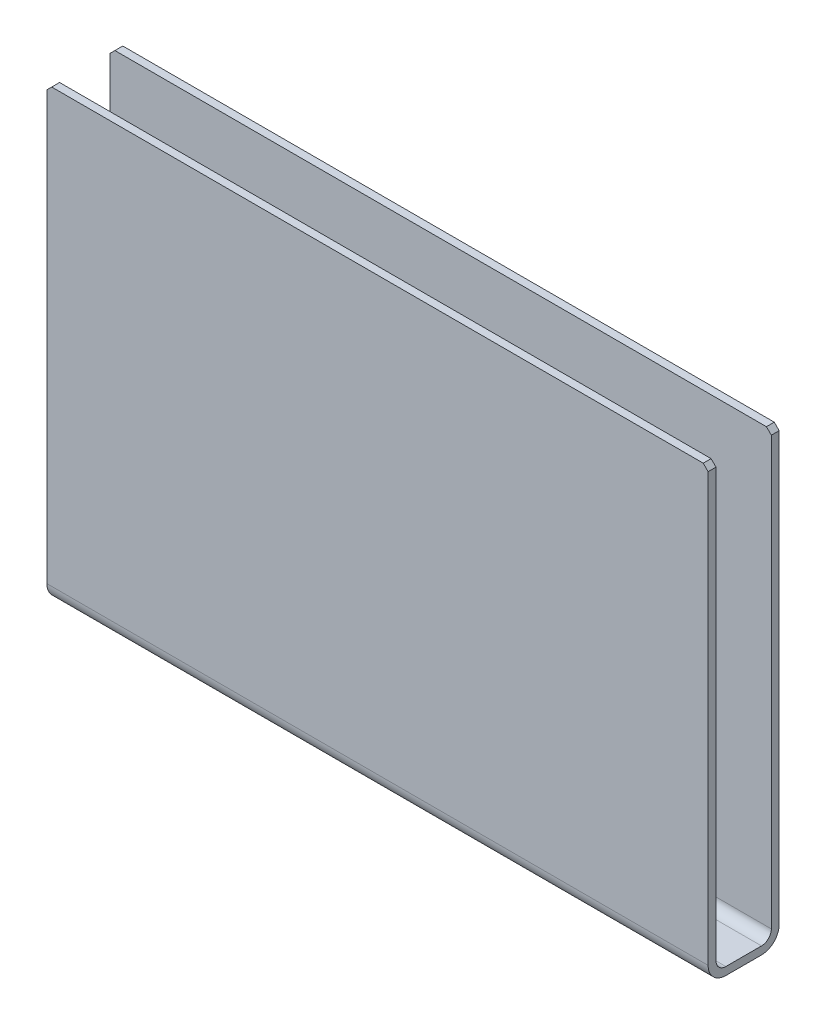
ISO-10303-21;
HEADER;
FILE_DESCRIPTION(('STEP AP214'),'2;1');
FILE_NAME('part.step','',(''),(''),'','','');
FILE_SCHEMA(('AUTOMOTIVE_DESIGN { 1 0 10303 214 1 1 1 1 }'));
ENDSEC;
DATA;
#1=APPLICATION_CONTEXT('core data for automotive mechanical design processes');
#2=APPLICATION_PROTOCOL_DEFINITION('international standard','automotive_design',2000,#1);
#3=PRODUCT_CONTEXT('',#1,'mechanical');
#4=PRODUCT('Part','Part','',(#3));
#5=PRODUCT_RELATED_PRODUCT_CATEGORY('part','',(#4));
#6=PRODUCT_DEFINITION_FORMATION('','',#4);
#7=PRODUCT_DEFINITION_CONTEXT('part definition',#1,'design');
#8=PRODUCT_DEFINITION('design','',#6,#7);
#9=PRODUCT_DEFINITION_SHAPE('','',#8);
#10=(LENGTH_UNIT() NAMED_UNIT(*) SI_UNIT(.MILLI.,.METRE.));
#11=(NAMED_UNIT(*) PLANE_ANGLE_UNIT() SI_UNIT($,.RADIAN.));
#12=(NAMED_UNIT(*) SI_UNIT($,.STERADIAN.) SOLID_ANGLE_UNIT());
#13=UNCERTAINTY_MEASURE_WITH_UNIT(LENGTH_MEASURE(1.E-05),#10,'distance_accuracy_value','');
#14=(GEOMETRIC_REPRESENTATION_CONTEXT(3) GLOBAL_UNCERTAINTY_ASSIGNED_CONTEXT((#13)) GLOBAL_UNIT_ASSIGNED_CONTEXT((#10,
#11,#12)) REPRESENTATION_CONTEXT('',''));
#15=CARTESIAN_POINT('',(0.,0.,0.));
#16=DIRECTION('',(0.,0.,1.));
#17=DIRECTION('',(1.,0.,0.));
#18=AXIS2_PLACEMENT_3D('',#15,#16,#17);
#19=CARTESIAN_POINT('',(2.5,5.4,2.4));
#20=DIRECTION('',(-1.,0.,0.));
#21=DIRECTION('',(0.,1.,0.));
#22=AXIS2_PLACEMENT_3D('',#19,#20,#21);
#23=PLANE('',#22);
#24=DIRECTION('',(0.,-1.,0.));
#25=VECTOR('',#24,1.);
#26=CARTESIAN_POINT('',(2.5,137.5,21.7));
#27=LINE('',#26,#25);
#28=CARTESIAN_POINT('',(2.5,136.,21.7));
#29=VERTEX_POINT('',#28);
#30=CARTESIAN_POINT('',(2.5,5.4,21.7));
#31=VERTEX_POINT('',#30);
#32=EDGE_CURVE('E154',#29,#31,#27,.T.);
#33=ORIENTED_EDGE('',*,*,#32,.F.);
#34=DIRECTION('',(0.,0.,-1.));
#35=VECTOR('',#34,1.);
#36=CARTESIAN_POINT('',(2.5,136.,2.4));
#37=LINE('',#36,#35);
#38=CARTESIAN_POINT('',(2.5,136.,19.3));
#39=VERTEX_POINT('',#38);
#40=EDGE_CURVE('E246',#29,#39,#37,.T.);
#41=ORIENTED_EDGE('',*,*,#40,.T.);
#42=DIRECTION('',(0.,-1.,0.));
#43=VECTOR('',#42,1.);
#44=CARTESIAN_POINT('',(2.5,137.5,19.3));
#45=LINE('',#44,#43);
#46=CARTESIAN_POINT('',(2.5,5.4,19.3));
#47=VERTEX_POINT('',#46);
#48=EDGE_CURVE('E177',#39,#47,#45,.T.);
#49=ORIENTED_EDGE('',*,*,#48,.T.);
#50=CARTESIAN_POINT('',(2.5,5.4,16.3));
#51=DIRECTION('',(1.,0.,0.));
#52=DIRECTION('',(0.,1.,0.));
#53=AXIS2_PLACEMENT_3D('',#50,#51,#52);
#54=CIRCLE('',#53,3.);
#55=CARTESIAN_POINT('',(2.5,2.4,16.3));
#56=VERTEX_POINT('',#55);
#57=EDGE_CURVE('E190',#47,#56,#54,.T.);
#58=ORIENTED_EDGE('',*,*,#57,.T.);
#59=DIRECTION('',(0.,0.,-1.));
#60=VECTOR('',#59,1.);
#61=CARTESIAN_POINT('',(2.5,2.4,16.3));
#62=LINE('',#61,#60);
#63=CARTESIAN_POINT('',(2.5,2.4,5.4));
#64=VERTEX_POINT('',#63);
#65=EDGE_CURVE('E195',#56,#64,#62,.T.);
#66=ORIENTED_EDGE('',*,*,#65,.T.);
#67=CARTESIAN_POINT('',(2.5,5.4,5.4));
#68=DIRECTION('',(1.,0.,0.));
#69=DIRECTION('',(0.,1.,0.));
#70=AXIS2_PLACEMENT_3D('',#67,#68,#69);
#71=CIRCLE('',#70,3.);
#72=CARTESIAN_POINT('',(2.5,5.4,2.4));
#73=VERTEX_POINT('',#72);
#74=EDGE_CURVE('E200',#64,#73,#71,.T.);
#75=ORIENTED_EDGE('',*,*,#74,.T.);
#76=DIRECTION('',(0.,1.,0.));
#77=VECTOR('',#76,1.);
#78=CARTESIAN_POINT('',(2.5,5.4,2.4));
#79=LINE('',#78,#77);
#80=CARTESIAN_POINT('',(2.5,136.,2.4));
#81=VERTEX_POINT('',#80);
#82=EDGE_CURVE('E205',#73,#81,#79,.T.);
#83=ORIENTED_EDGE('',*,*,#82,.T.);
#84=DIRECTION('',(0.,0.,-1.));
#85=VECTOR('',#84,1.);
#86=CARTESIAN_POINT('',(2.5,136.,2.4));
#87=LINE('',#86,#85);
#88=CARTESIAN_POINT('',(2.5,136.,0.));
#89=VERTEX_POINT('',#88);
#90=EDGE_CURVE('E243',#81,#89,#87,.T.);
#91=ORIENTED_EDGE('',*,*,#90,.T.);
#92=DIRECTION('',(0.,1.,0.));
#93=VECTOR('',#92,1.);
#94=CARTESIAN_POINT('',(2.5,5.4,0.));
#95=LINE('',#94,#93);
#96=CARTESIAN_POINT('',(2.5,5.4,0.));
#97=VERTEX_POINT('',#96);
#98=EDGE_CURVE('E168',#97,#89,#95,.T.);
#99=ORIENTED_EDGE('',*,*,#98,.F.);
#100=CARTESIAN_POINT('',(2.5,5.4,5.4));
#101=DIRECTION('',(1.,0.,0.));
#102=DIRECTION('',(0.,0.,-1.));
#103=AXIS2_PLACEMENT_3D('',#100,#101,#102);
#104=CIRCLE('',#103,5.4);
#105=CARTESIAN_POINT('',(2.5,0.,5.4));
#106=VERTEX_POINT('',#105);
#107=EDGE_CURVE('E164',#106,#97,#104,.T.);
#108=ORIENTED_EDGE('',*,*,#107,.F.);
#109=DIRECTION('',(0.,0.,-1.));
#110=VECTOR('',#109,1.);
#111=CARTESIAN_POINT('',(2.5,0.,16.3));
#112=LINE('',#111,#110);
#113=CARTESIAN_POINT('',(2.5,0.,16.3));
#114=VERTEX_POINT('',#113);
#115=EDGE_CURVE('E150',#114,#106,#112,.T.);
#116=ORIENTED_EDGE('',*,*,#115,.F.);
#117=CARTESIAN_POINT('',(2.5,5.4,16.3));
#118=DIRECTION('',(1.,0.,0.));
#119=DIRECTION('',(0.,0.,-1.));
#120=AXIS2_PLACEMENT_3D('',#117,#118,#119);
#121=CIRCLE('',#120,5.4);
#122=EDGE_CURVE('E142',#31,#114,#121,.T.);
#123=ORIENTED_EDGE('',*,*,#122,.F.);
#124=EDGE_LOOP('',(#33,#41,#49,#58,#66,#75,#83,#91,#99,#108,#116,#123));
#125=FACE_BOUND('',#124,.T.);
#126=ADVANCED_FACE('F16',(#125),#23,.T.);
#127=CARTESIAN_POINT('',(2.5,137.5,2.4));
#128=DIRECTION('',(0.,1.,0.));
#129=DIRECTION('',(1.,0.,0.));
#130=AXIS2_PLACEMENT_3D('',#127,#128,#129);
#131=PLANE('',#130);
#132=DIRECTION('',(-1.,0.,0.));
#133=VECTOR('',#132,1.);
#134=CARTESIAN_POINT('',(2.5,137.5,0.));
#135=LINE('',#134,#133);
#136=CARTESIAN_POINT('',(4.,137.5,0.));
#137=VERTEX_POINT('',#136);
#138=CARTESIAN_POINT('',(203.,137.5,0.));
#139=VERTEX_POINT('',#138);
#140=EDGE_CURVE('E174',#137,#139,#135,.F.);
#141=ORIENTED_EDGE('',*,*,#140,.F.);
#142=DIRECTION('',(0.,0.,1.));
#143=VECTOR('',#142,1.);
#144=CARTESIAN_POINT('',(4.,137.5,2.4));
#145=LINE('',#144,#143);
#146=CARTESIAN_POINT('',(4.,137.5,2.4));
#147=VERTEX_POINT('',#146);
#148=EDGE_CURVE('E37',#137,#147,#145,.T.);
#149=ORIENTED_EDGE('',*,*,#148,.T.);
#150=DIRECTION('',(1.,0.,0.));
#151=VECTOR('',#150,1.);
#152=CARTESIAN_POINT('',(2.5,137.5,2.4));
#153=LINE('',#152,#151);
#154=CARTESIAN_POINT('',(203.,137.5,2.4));
#155=VERTEX_POINT('',#154);
#156=EDGE_CURVE('E208',#147,#155,#153,.T.);
#157=ORIENTED_EDGE('',*,*,#156,.T.);
#158=DIRECTION('',(0.,0.,-1.));
#159=VECTOR('',#158,1.);
#160=CARTESIAN_POINT('',(203.,137.5,2.4));
#161=LINE('',#160,#159);
#162=EDGE_CURVE('E252',#155,#139,#161,.T.);
#163=ORIENTED_EDGE('',*,*,#162,.T.);
#164=EDGE_LOOP('',(#141,#149,#157,#163));
#165=FACE_BOUND('',#164,.T.);
#166=ADVANCED_FACE('F256',(#165),#131,.T.);
#167=CARTESIAN_POINT('',(204.5,137.5,19.3));
#168=DIRECTION('',(-1.,0.,0.));
#169=DIRECTION('',(0.,-1.,0.));
#170=AXIS2_PLACEMENT_3D('',#167,#168,#169);
#171=PLANE('',#170);
#172=DIRECTION('',(0.,-1.,0.));
#173=VECTOR('',#172,1.);
#174=CARTESIAN_POINT('',(204.5,137.5,19.3));
#175=LINE('',#174,#173);
#176=CARTESIAN_POINT('',(204.5,136.,19.3));
#177=VERTEX_POINT('',#176);
#178=CARTESIAN_POINT('',(204.5,5.4,19.3));
#179=VERTEX_POINT('',#178);
#180=EDGE_CURVE('E193',#177,#179,#175,.T.);
#181=ORIENTED_EDGE('',*,*,#180,.F.);
#182=DIRECTION('',(0.,0.,-1.));
#183=VECTOR('',#182,1.);
#184=CARTESIAN_POINT('',(204.5,136.,19.3));
#185=LINE('',#184,#183);
#186=CARTESIAN_POINT('',(204.5,136.,21.7));
#187=VERTEX_POINT('',#186);
#188=EDGE_CURVE('E138',#177,#187,#185,.F.);
#189=ORIENTED_EDGE('',*,*,#188,.T.);
#190=DIRECTION('',(0.,-1.,0.));
#191=VECTOR('',#190,1.);
#192=CARTESIAN_POINT('',(204.5,137.5,21.7));
#193=LINE('',#192,#191);
#194=CARTESIAN_POINT('',(204.5,5.4,21.7));
#195=VERTEX_POINT('',#194);
#196=EDGE_CURVE('E130',#187,#195,#193,.T.);
#197=ORIENTED_EDGE('',*,*,#196,.T.);
#198=CARTESIAN_POINT('',(204.5,5.4,16.3));
#199=DIRECTION('',(1.,0.,0.));
#200=DIRECTION('',(0.,0.,-1.));
#201=AXIS2_PLACEMENT_3D('',#198,#199,#200);
#202=CIRCLE('',#201,5.4);
#203=CARTESIAN_POINT('',(204.5,0.,16.3));
#204=VERTEX_POINT('',#203);
#205=EDGE_CURVE('E135',#195,#204,#202,.T.);
#206=ORIENTED_EDGE('',*,*,#205,.T.);
#207=DIRECTION('',(0.,0.,-1.));
#208=VECTOR('',#207,1.);
#209=CARTESIAN_POINT('',(204.5,0.,16.3));
#210=LINE('',#209,#208);
#211=CARTESIAN_POINT('',(204.5,0.,5.4));
#212=VERTEX_POINT('',#211);
#213=EDGE_CURVE('E160',#204,#212,#210,.T.);
#214=ORIENTED_EDGE('',*,*,#213,.T.);
#215=CARTESIAN_POINT('',(204.5,5.4,5.4));
#216=DIRECTION('',(1.,0.,0.));
#217=DIRECTION('',(0.,0.,-1.));
#218=AXIS2_PLACEMENT_3D('',#215,#216,#217);
#219=CIRCLE('',#218,5.4);
#220=CARTESIAN_POINT('',(204.5,5.4,0.));
#221=VERTEX_POINT('',#220);
#222=EDGE_CURVE('E165',#212,#221,#219,.T.);
#223=ORIENTED_EDGE('',*,*,#222,.T.);
#224=DIRECTION('',(0.,1.,0.));
#225=VECTOR('',#224,1.);
#226=CARTESIAN_POINT('',(204.5,5.4,0.));
#227=LINE('',#226,#225);
#228=CARTESIAN_POINT('',(204.5,136.,0.));
#229=VERTEX_POINT('',#228);
#230=EDGE_CURVE('E169',#221,#229,#227,.T.);
#231=ORIENTED_EDGE('',*,*,#230,.T.);
#232=DIRECTION('',(0.,0.,-1.));
#233=VECTOR('',#232,1.);
#234=CARTESIAN_POINT('',(204.5,136.,19.3));
#235=LINE('',#234,#233);
#236=CARTESIAN_POINT('',(204.5,136.,2.4));
#237=VERTEX_POINT('',#236);
#238=EDGE_CURVE('E185',#229,#237,#235,.F.);
#239=ORIENTED_EDGE('',*,*,#238,.T.);
#240=DIRECTION('',(0.,1.,0.));
#241=VECTOR('',#240,1.);
#242=CARTESIAN_POINT('',(204.5,5.4,2.4));
#243=LINE('',#242,#241);
#244=CARTESIAN_POINT('',(204.5,5.4,2.4));
#245=VERTEX_POINT('',#244);
#246=EDGE_CURVE('E218',#245,#237,#243,.T.);
#247=ORIENTED_EDGE('',*,*,#246,.F.);
#248=CARTESIAN_POINT('',(204.5,5.4,5.4));
#249=DIRECTION('',(1.,0.,0.));
#250=DIRECTION('',(0.,1.,0.));
#251=AXIS2_PLACEMENT_3D('',#248,#249,#250);
#252=CIRCLE('',#251,3.);
#253=CARTESIAN_POINT('',(204.5,2.4,5.4));
#254=VERTEX_POINT('',#253);
#255=EDGE_CURVE('E215',#254,#245,#252,.T.);
#256=ORIENTED_EDGE('',*,*,#255,.F.);
#257=DIRECTION('',(0.,0.,-1.));
#258=VECTOR('',#257,1.);
#259=CARTESIAN_POINT('',(204.5,2.4,16.3));
#260=LINE('',#259,#258);
#261=CARTESIAN_POINT('',(204.5,2.4,16.3));
#262=VERTEX_POINT('',#261);
#263=EDGE_CURVE('E203',#262,#254,#260,.T.);
#264=ORIENTED_EDGE('',*,*,#263,.F.);
#265=CARTESIAN_POINT('',(204.5,5.4,16.3));
#266=DIRECTION('',(1.,0.,0.));
#267=DIRECTION('',(0.,1.,0.));
#268=AXIS2_PLACEMENT_3D('',#265,#266,#267);
#269=CIRCLE('',#268,3.);
#270=EDGE_CURVE('E198',#179,#262,#269,.T.);
#271=ORIENTED_EDGE('',*,*,#270,.F.);
#272=EDGE_LOOP('',(#181,#189,#197,#206,#214,#223,#231,#239,#247,#256,#264,#271));
#273=FACE_BOUND('',#272,.T.);
#274=ADVANCED_FACE('F133',(#273),#171,.F.);
#275=CARTESIAN_POINT('',(2.5,137.5,19.3));
#276=DIRECTION('',(0.,-1.,0.));
#277=DIRECTION('',(1.,0.,0.));
#278=AXIS2_PLACEMENT_3D('',#275,#276,#277);
#279=PLANE('',#278);
#280=DIRECTION('',(1.,0.,0.));
#281=VECTOR('',#280,1.);
#282=CARTESIAN_POINT('',(2.5,137.5,21.7));
#283=LINE('',#282,#281);
#284=CARTESIAN_POINT('',(4.,137.5,21.7));
#285=VERTEX_POINT('',#284);
#286=CARTESIAN_POINT('',(203.,137.5,21.7));
#287=VERTEX_POINT('',#286);
#288=EDGE_CURVE('E141',#285,#287,#283,.T.);
#289=ORIENTED_EDGE('',*,*,#288,.T.);
#290=DIRECTION('',(0.,0.,1.));
#291=VECTOR('',#290,1.);
#292=CARTESIAN_POINT('',(203.,137.5,19.3));
#293=LINE('',#292,#291);
#294=CARTESIAN_POINT('',(203.,137.5,19.3));
#295=VERTEX_POINT('',#294);
#296=EDGE_CURVE('E237',#287,#295,#293,.F.);
#297=ORIENTED_EDGE('',*,*,#296,.T.);
#298=DIRECTION('',(1.,0.,0.));
#299=VECTOR('',#298,1.);
#300=CARTESIAN_POINT('',(2.5,137.5,19.3));
#301=LINE('',#300,#299);
#302=CARTESIAN_POINT('',(4.,137.5,19.3));
#303=VERTEX_POINT('',#302);
#304=EDGE_CURVE('E189',#303,#295,#301,.T.);
#305=ORIENTED_EDGE('',*,*,#304,.F.);
#306=DIRECTION('',(0.,0.,-1.));
#307=VECTOR('',#306,1.);
#308=CARTESIAN_POINT('',(4.,137.5,19.3));
#309=LINE('',#308,#307);
#310=EDGE_CURVE('E234',#303,#285,#309,.F.);
#311=ORIENTED_EDGE('',*,*,#310,.T.);
#312=EDGE_LOOP('',(#289,#297,#305,#311));
#313=FACE_BOUND('',#312,.T.);
#314=ADVANCED_FACE('F291',(#313),#279,.F.);
#315=CARTESIAN_POINT('',(2.5,137.5,21.7));
#316=DIRECTION('',(0.,0.,1.));
#317=DIRECTION('',(0.,-1.,0.));
#318=AXIS2_PLACEMENT_3D('',#315,#316,#317);
#319=PLANE('',#318);
#320=ORIENTED_EDGE('',*,*,#196,.F.);
#321=DIRECTION('',(0.707106781186548,-0.707106781186548,0.));
#322=VECTOR('',#321,1.);
#323=CARTESIAN_POINT('',(102.75,237.75,21.7));
#324=LINE('',#323,#322);
#325=EDGE_CURVE('E232',#187,#287,#324,.F.);
#326=ORIENTED_EDGE('',*,*,#325,.T.);
#327=ORIENTED_EDGE('',*,*,#288,.F.);
#328=DIRECTION('',(-0.707106781186547,-0.707106781186548,0.));
#329=VECTOR('',#328,1.);
#330=CARTESIAN_POINT('',(3.25,136.75,21.7));
#331=LINE('',#330,#329);
#332=EDGE_CURVE('E230',#285,#29,#331,.T.);
#333=ORIENTED_EDGE('',*,*,#332,.T.);
#334=ORIENTED_EDGE('',*,*,#32,.T.);
#335=DIRECTION('',(1.,0.,0.));
#336=VECTOR('',#335,1.);
#337=CARTESIAN_POINT('',(2.5,5.4,21.7));
#338=LINE('',#337,#336);
#339=EDGE_CURVE('E147',#31,#195,#338,.T.);
#340=ORIENTED_EDGE('',*,*,#339,.T.);
#341=EDGE_LOOP('',(#320,#326,#327,#333,#334,#340));
#342=FACE_BOUND('',#341,.T.);
#343=ADVANCED_FACE('F152',(#342),#319,.T.);
#344=CARTESIAN_POINT('',(2.5,5.4,16.3));
#345=DIRECTION('',(1.,0.,0.));
#346=DIRECTION('',(0.,0.,-1.));
#347=AXIS2_PLACEMENT_3D('',#344,#345,#346);
#348=CYLINDRICAL_SURFACE('',#347,5.4);
#349=ORIENTED_EDGE('',*,*,#205,.F.);
#350=ORIENTED_EDGE('',*,*,#339,.F.);
#351=ORIENTED_EDGE('',*,*,#122,.T.);
#352=DIRECTION('',(1.,0.,0.));
#353=VECTOR('',#352,1.);
#354=CARTESIAN_POINT('',(2.5,0.,16.3));
#355=LINE('',#354,#353);
#356=EDGE_CURVE('E149',#114,#204,#355,.T.);
#357=ORIENTED_EDGE('',*,*,#356,.T.);
#358=EDGE_LOOP('',(#349,#350,#351,#357));
#359=FACE_BOUND('',#358,.T.);
#360=ADVANCED_FACE('F146',(#359),#348,.T.);
#361=CARTESIAN_POINT('',(2.5,0.,16.3));
#362=DIRECTION('',(0.,-1.,0.));
#363=DIRECTION('',(0.,0.,-1.));
#364=AXIS2_PLACEMENT_3D('',#361,#362,#363);
#365=PLANE('',#364);
#366=ORIENTED_EDGE('',*,*,#213,.F.);
#367=ORIENTED_EDGE('',*,*,#356,.F.);
#368=ORIENTED_EDGE('',*,*,#115,.T.);
#369=DIRECTION('',(1.,0.,0.));
#370=VECTOR('',#369,1.);
#371=CARTESIAN_POINT('',(2.5,0.,5.4));
#372=LINE('',#371,#370);
#373=EDGE_CURVE('E161',#106,#212,#372,.T.);
#374=ORIENTED_EDGE('',*,*,#373,.T.);
#375=EDGE_LOOP('',(#366,#367,#368,#374));
#376=FACE_BOUND('',#375,.T.);
#377=ADVANCED_FACE('F322',(#376),#365,.T.);
#378=CARTESIAN_POINT('',(2.5,5.4,5.4));
#379=DIRECTION('',(1.,0.,0.));
#380=DIRECTION('',(0.,0.,-1.));
#381=AXIS2_PLACEMENT_3D('',#378,#379,#380);
#382=CYLINDRICAL_SURFACE('',#381,5.4);
#383=ORIENTED_EDGE('',*,*,#222,.F.);
#384=ORIENTED_EDGE('',*,*,#373,.F.);
#385=ORIENTED_EDGE('',*,*,#107,.T.);
#386=DIRECTION('',(1.,0.,0.));
#387=VECTOR('',#386,1.);
#388=CARTESIAN_POINT('',(2.5,5.4,0.));
#389=LINE('',#388,#387);
#390=EDGE_CURVE('E166',#97,#221,#389,.T.);
#391=ORIENTED_EDGE('',*,*,#390,.T.);
#392=EDGE_LOOP('',(#383,#384,#385,#391));
#393=FACE_BOUND('',#392,.T.);
#394=ADVANCED_FACE('F324',(#393),#382,.T.);
#395=CARTESIAN_POINT('',(2.5,5.4,0.));
#396=DIRECTION('',(0.,0.,-1.));
#397=DIRECTION('',(-1.,0.,0.));
#398=AXIS2_PLACEMENT_3D('',#395,#396,#397);
#399=PLANE('',#398);
#400=ORIENTED_EDGE('',*,*,#98,.T.);
#401=DIRECTION('',(-0.707106781186547,-0.707106781186548,0.));
#402=VECTOR('',#401,1.);
#403=CARTESIAN_POINT('',(-62.8,70.7,0.));
#404=LINE('',#403,#402);
#405=EDGE_CURVE('E250',#89,#137,#404,.F.);
#406=ORIENTED_EDGE('',*,*,#405,.T.);
#407=ORIENTED_EDGE('',*,*,#140,.T.);
#408=DIRECTION('',(0.707106781186548,-0.707106781186548,0.));
#409=VECTOR('',#408,1.);
#410=CARTESIAN_POINT('',(168.8,171.7,0.));
#411=LINE('',#410,#409);
#412=EDGE_CURVE('E248',#139,#229,#411,.T.);
#413=ORIENTED_EDGE('',*,*,#412,.T.);
#414=ORIENTED_EDGE('',*,*,#230,.F.);
#415=ORIENTED_EDGE('',*,*,#390,.F.);
#416=EDGE_LOOP('',(#400,#406,#407,#413,#414,#415));
#417=FACE_BOUND('',#416,.T.);
#418=ADVANCED_FACE('F259',(#417),#399,.T.);
#419=CARTESIAN_POINT('',(2.5,137.5,19.3));
#420=DIRECTION('',(0.,0.,1.));
#421=DIRECTION('',(0.,-1.,0.));
#422=AXIS2_PLACEMENT_3D('',#419,#420,#421);
#423=PLANE('',#422);
#424=ORIENTED_EDGE('',*,*,#304,.T.);
#425=DIRECTION('',(-0.707106781186548,0.707106781186548,0.));
#426=VECTOR('',#425,1.);
#427=CARTESIAN_POINT('',(204.5,136.,19.3));
#428=LINE('',#427,#426);
#429=EDGE_CURVE('E241',#295,#177,#428,.F.);
#430=ORIENTED_EDGE('',*,*,#429,.T.);
#431=ORIENTED_EDGE('',*,*,#180,.T.);
#432=DIRECTION('',(1.,0.,0.));
#433=VECTOR('',#432,1.);
#434=CARTESIAN_POINT('',(2.5,5.4,19.3));
#435=LINE('',#434,#433);
#436=EDGE_CURVE('E194',#47,#179,#435,.T.);
#437=ORIENTED_EDGE('',*,*,#436,.F.);
#438=ORIENTED_EDGE('',*,*,#48,.F.);
#439=DIRECTION('',(0.707106781186547,0.707106781186548,0.));
#440=VECTOR('',#439,1.);
#441=CARTESIAN_POINT('',(4.,137.5,19.3));
#442=LINE('',#441,#440);
#443=EDGE_CURVE('E239',#39,#303,#442,.T.);
#444=ORIENTED_EDGE('',*,*,#443,.T.);
#445=EDGE_LOOP('',(#424,#430,#431,#437,#438,#444));
#446=FACE_BOUND('',#445,.T.);
#447=ADVANCED_FACE('F309',(#446),#423,.F.);
#448=CARTESIAN_POINT('',(2.5,5.4,16.3));
#449=DIRECTION('',(1.,0.,0.));
#450=DIRECTION('',(0.,0.,-1.));
#451=AXIS2_PLACEMENT_3D('',#448,#449,#450);
#452=CYLINDRICAL_SURFACE('',#451,3.);
#453=ORIENTED_EDGE('',*,*,#270,.T.);
#454=DIRECTION('',(1.,0.,0.));
#455=VECTOR('',#454,1.);
#456=CARTESIAN_POINT('',(2.5,2.4,16.3));
#457=LINE('',#456,#455);
#458=EDGE_CURVE('E199',#56,#262,#457,.T.);
#459=ORIENTED_EDGE('',*,*,#458,.F.);
#460=ORIENTED_EDGE('',*,*,#57,.F.);
#461=ORIENTED_EDGE('',*,*,#436,.T.);
#462=EDGE_LOOP('',(#453,#459,#460,#461));
#463=FACE_BOUND('',#462,.T.);
#464=ADVANCED_FACE('F316',(#463),#452,.F.);
#465=CARTESIAN_POINT('',(2.5,2.4,16.3));
#466=DIRECTION('',(0.,-1.,0.));
#467=DIRECTION('',(0.,0.,-1.));
#468=AXIS2_PLACEMENT_3D('',#465,#466,#467);
#469=PLANE('',#468);
#470=ORIENTED_EDGE('',*,*,#263,.T.);
#471=DIRECTION('',(1.,0.,0.));
#472=VECTOR('',#471,1.);
#473=CARTESIAN_POINT('',(2.5,2.4,5.4));
#474=LINE('',#473,#472);
#475=EDGE_CURVE('E204',#64,#254,#474,.T.);
#476=ORIENTED_EDGE('',*,*,#475,.F.);
#477=ORIENTED_EDGE('',*,*,#65,.F.);
#478=ORIENTED_EDGE('',*,*,#458,.T.);
#479=EDGE_LOOP('',(#470,#476,#477,#478));
#480=FACE_BOUND('',#479,.T.);
#481=ADVANCED_FACE('F339',(#480),#469,.F.);
#482=CARTESIAN_POINT('',(2.5,5.4,5.4));
#483=DIRECTION('',(1.,0.,0.));
#484=DIRECTION('',(0.,0.,-1.));
#485=AXIS2_PLACEMENT_3D('',#482,#483,#484);
#486=CYLINDRICAL_SURFACE('',#485,3.);
#487=ORIENTED_EDGE('',*,*,#255,.T.);
#488=DIRECTION('',(1.,0.,0.));
#489=VECTOR('',#488,1.);
#490=CARTESIAN_POINT('',(2.5,5.4,2.4));
#491=LINE('',#490,#489);
#492=EDGE_CURVE('E209',#73,#245,#491,.T.);
#493=ORIENTED_EDGE('',*,*,#492,.F.);
#494=ORIENTED_EDGE('',*,*,#74,.F.);
#495=ORIENTED_EDGE('',*,*,#475,.T.);
#496=EDGE_LOOP('',(#487,#493,#494,#495));
#497=FACE_BOUND('',#496,.T.);
#498=ADVANCED_FACE('F274',(#497),#486,.F.);
#499=CARTESIAN_POINT('',(2.5,5.4,2.4));
#500=DIRECTION('',(0.,0.,-1.));
#501=DIRECTION('',(-1.,0.,0.));
#502=AXIS2_PLACEMENT_3D('',#499,#500,#501);
#503=PLANE('',#502);
#504=ORIENTED_EDGE('',*,*,#156,.F.);
#505=DIRECTION('',(0.707106781186547,0.707106781186548,0.));
#506=VECTOR('',#505,1.);
#507=CARTESIAN_POINT('',(2.5,136.,2.4));
#508=LINE('',#507,#506);
#509=EDGE_CURVE('E11',#147,#81,#508,.F.);
#510=ORIENTED_EDGE('',*,*,#509,.T.);
#511=ORIENTED_EDGE('',*,*,#82,.F.);
#512=ORIENTED_EDGE('',*,*,#492,.T.);
#513=ORIENTED_EDGE('',*,*,#246,.T.);
#514=DIRECTION('',(-0.707106781186548,0.707106781186548,0.));
#515=VECTOR('',#514,1.);
#516=CARTESIAN_POINT('',(203.,137.5,2.4));
#517=LINE('',#516,#515);
#518=EDGE_CURVE('E24',#237,#155,#517,.T.);
#519=ORIENTED_EDGE('',*,*,#518,.T.);
#520=EDGE_LOOP('',(#504,#510,#511,#512,#513,#519));
#521=FACE_BOUND('',#520,.T.);
#522=ADVANCED_FACE('F270',(#521),#503,.F.);
#523=CARTESIAN_POINT('',(204.5,136.,19.3));
#524=DIRECTION('',(-0.707106781186548,-0.707106781186548,0.));
#525=DIRECTION('',(0.707106781186548,-0.707106781186548,0.));
#526=AXIS2_PLACEMENT_3D('',#523,#524,#525);
#527=PLANE('',#526);
#528=ORIENTED_EDGE('',*,*,#429,.F.);
#529=ORIENTED_EDGE('',*,*,#296,.F.);
#530=ORIENTED_EDGE('',*,*,#325,.F.);
#531=ORIENTED_EDGE('',*,*,#188,.F.);
#532=EDGE_LOOP('',(#528,#529,#530,#531));
#533=FACE_BOUND('',#532,.T.);
#534=ADVANCED_FACE('F295',(#533),#527,.F.);
#535=CARTESIAN_POINT('',(4.,137.5,19.3));
#536=DIRECTION('',(-0.707106781186548,0.707106781186547,0.));
#537=DIRECTION('',(-0.707106781186547,-0.707106781186548,0.));
#538=AXIS2_PLACEMENT_3D('',#535,#536,#537);
#539=PLANE('',#538);
#540=ORIENTED_EDGE('',*,*,#443,.F.);
#541=ORIENTED_EDGE('',*,*,#40,.F.);
#542=ORIENTED_EDGE('',*,*,#332,.F.);
#543=ORIENTED_EDGE('',*,*,#310,.F.);
#544=EDGE_LOOP('',(#540,#541,#542,#543));
#545=FACE_BOUND('',#544,.T.);
#546=ADVANCED_FACE('F282',(#545),#539,.T.);
#547=CARTESIAN_POINT('',(2.5,136.,2.4));
#548=DIRECTION('',(0.707106781186548,-0.707106781186547,0.));
#549=DIRECTION('',(0.707106781186547,0.707106781186548,0.));
#550=AXIS2_PLACEMENT_3D('',#547,#548,#549);
#551=PLANE('',#550);
#552=ORIENTED_EDGE('',*,*,#509,.F.);
#553=ORIENTED_EDGE('',*,*,#148,.F.);
#554=ORIENTED_EDGE('',*,*,#405,.F.);
#555=ORIENTED_EDGE('',*,*,#90,.F.);
#556=EDGE_LOOP('',(#552,#553,#554,#555));
#557=FACE_BOUND('',#556,.T.);
#558=ADVANCED_FACE('F265',(#557),#551,.F.);
#559=CARTESIAN_POINT('',(203.,137.5,2.4));
#560=DIRECTION('',(0.707106781186548,0.707106781186548,0.));
#561=DIRECTION('',(-0.707106781186548,0.707106781186548,0.));
#562=AXIS2_PLACEMENT_3D('',#559,#560,#561);
#563=PLANE('',#562);
#564=ORIENTED_EDGE('',*,*,#518,.F.);
#565=ORIENTED_EDGE('',*,*,#238,.F.);
#566=ORIENTED_EDGE('',*,*,#412,.F.);
#567=ORIENTED_EDGE('',*,*,#162,.F.);
#568=EDGE_LOOP('',(#564,#565,#566,#567));
#569=FACE_BOUND('',#568,.T.);
#570=ADVANCED_FACE('F18',(#569),#563,.T.);
#571=CLOSED_SHELL('',(#126,#166,#274,#314,#343,#360,#377,#394,#418,#447,#464,#481,#498,#522,
#534,#546,#558,#570));
#572=MANIFOLD_SOLID_BREP('B1',#571);
#573=ADVANCED_BREP_SHAPE_REPRESENTATION('',(#18,#572),#14);
#574=SHAPE_DEFINITION_REPRESENTATION(#9,#573);
ENDSEC;
END-ISO-10303-21;
